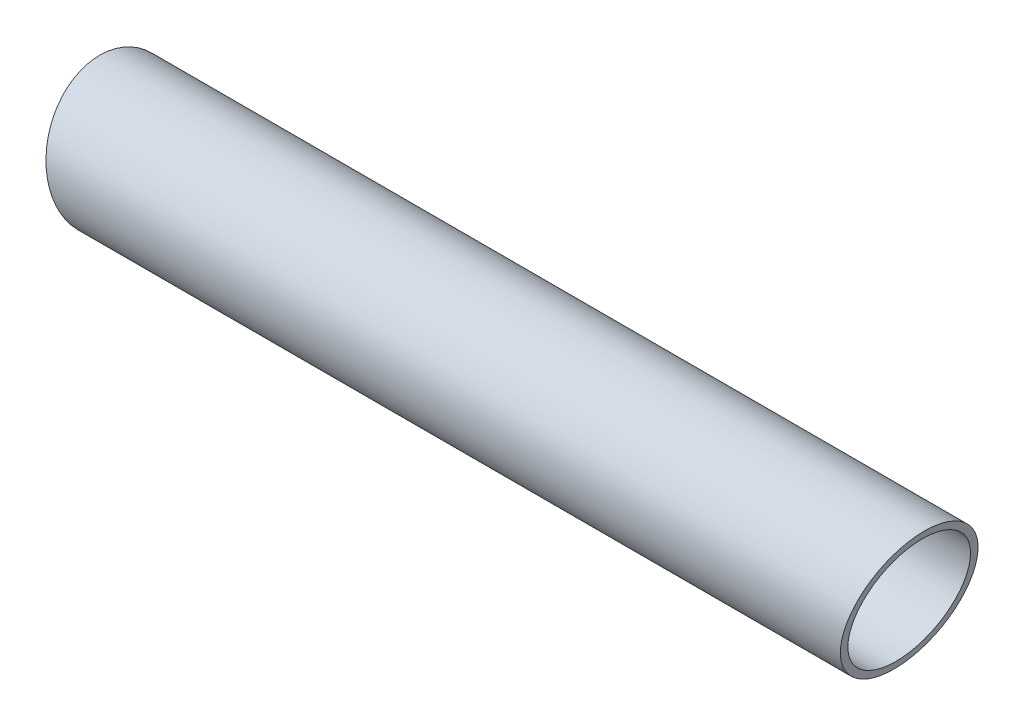
ISO-10303-21;
HEADER;
FILE_DESCRIPTION(('STEP AP214'),'2;1');
FILE_NAME('part.step','',(''),(''),'','','');
FILE_SCHEMA(('AUTOMOTIVE_DESIGN { 1 0 10303 214 1 1 1 1 }'));
ENDSEC;
DATA;
#1=APPLICATION_CONTEXT('core data for automotive mechanical design processes');
#2=APPLICATION_PROTOCOL_DEFINITION('international standard','automotive_design',2000,#1);
#3=PRODUCT_CONTEXT('',#1,'mechanical');
#4=PRODUCT('Part','Part','',(#3));
#5=PRODUCT_RELATED_PRODUCT_CATEGORY('part','',(#4));
#6=PRODUCT_DEFINITION_FORMATION('','',#4);
#7=PRODUCT_DEFINITION_CONTEXT('part definition',#1,'design');
#8=PRODUCT_DEFINITION('design','',#6,#7);
#9=PRODUCT_DEFINITION_SHAPE('','',#8);
#10=(LENGTH_UNIT() NAMED_UNIT(*) SI_UNIT(.MILLI.,.METRE.));
#11=(NAMED_UNIT(*) PLANE_ANGLE_UNIT() SI_UNIT($,.RADIAN.));
#12=(NAMED_UNIT(*) SI_UNIT($,.STERADIAN.) SOLID_ANGLE_UNIT());
#13=UNCERTAINTY_MEASURE_WITH_UNIT(LENGTH_MEASURE(1.E-05),#10,'distance_accuracy_value','');
#14=(GEOMETRIC_REPRESENTATION_CONTEXT(3) GLOBAL_UNCERTAINTY_ASSIGNED_CONTEXT((#13)) GLOBAL_UNIT_ASSIGNED_CONTEXT((#10,
#11,#12)) REPRESENTATION_CONTEXT('',''));
#15=CARTESIAN_POINT('',(0.,0.,0.));
#16=DIRECTION('',(0.,0.,1.));
#17=DIRECTION('',(1.,0.,0.));
#18=AXIS2_PLACEMENT_3D('',#15,#16,#17);
#19=CARTESIAN_POINT('',(-65.0000000000003,539.999999999999,-1140.));
#20=DIRECTION('',(1.,0.,0.));
#21=DIRECTION('',(0.,0.,-1.));
#22=AXIS2_PLACEMENT_3D('',#19,#20,#21);
#23=CYLINDRICAL_SURFACE('',#22,9.79999999999998);
#24=CARTESIAN_POINT('',(-64.9999999999999,539.999999999999,-1140.));
#25=DIRECTION('',(-0.975914622854119,-0.218152810890676,0.));
#26=DIRECTION('',(0.218152810890676,-0.975914622854119,0.));
#27=AXIS2_PLACEMENT_3D('',#24,#25,#26);
#28=ELLIPSE('',#27,10.0418620343441,9.79999999999998);
#29=CARTESIAN_POINT('',(-62.8093395706314,530.199999999999,-1140.));
#30=VERTEX_POINT('',#29);
#31=EDGE_CURVE('E53',#30,#30,#28,.T.);
#32=ORIENTED_EDGE('',*,*,#31,.T.);
#33=EDGE_LOOP('',(#32));
#34=FACE_BOUND('',#33,.T.);
#35=CARTESIAN_POINT('',(64.9999999999999,539.999999999999,-1140.));
#36=DIRECTION('',(0.975914622854119,-0.218152810890675,0.));
#37=DIRECTION('',(0.218152810890675,0.975914622854119,0.));
#38=AXIS2_PLACEMENT_3D('',#35,#36,#37);
#39=ELLIPSE('',#38,10.0418620343441,9.79999999999998);
#40=CARTESIAN_POINT('',(67.1906604293684,549.799999999999,-1140.));
#41=VERTEX_POINT('',#40);
#42=EDGE_CURVE('E43',#41,#41,#39,.T.);
#43=ORIENTED_EDGE('',*,*,#42,.T.);
#44=EDGE_LOOP('',(#43));
#45=FACE_BOUND('',#44,.T.);
#46=ADVANCED_FACE('F39',(#34,#45),#23,.F.);
#47=CARTESIAN_POINT('',(-65.0000000000003,539.999999999999,-1140.));
#48=DIRECTION('',(1.,0.,0.));
#49=DIRECTION('',(0.,0.,-1.));
#50=AXIS2_PLACEMENT_3D('',#47,#48,#49);
#51=CYLINDRICAL_SURFACE('',#50,11.);
#52=CARTESIAN_POINT('',(-64.9999999999999,539.999999999999,-1140.));
#53=DIRECTION('',(-0.975914622854119,-0.218152810890676,0.));
#54=DIRECTION('',(0.218152810890676,-0.975914622854119,0.));
#55=AXIS2_PLACEMENT_3D('',#52,#53,#54);
#56=ELLIPSE('',#55,11.2714777936515,11.);
#57=CARTESIAN_POINT('',(-62.541095436423,528.999999999999,-1140.));
#58=VERTEX_POINT('',#57);
#59=EDGE_CURVE('E47',#58,#58,#56,.T.);
#60=ORIENTED_EDGE('',*,*,#59,.F.);
#61=EDGE_LOOP('',(#60));
#62=FACE_BOUND('',#61,.T.);
#63=CARTESIAN_POINT('',(64.9999999999999,539.999999999999,-1140.));
#64=DIRECTION('',(0.975914622854119,-0.218152810890675,0.));
#65=DIRECTION('',(0.218152810890675,0.975914622854119,0.));
#66=AXIS2_PLACEMENT_3D('',#63,#64,#65);
#67=ELLIPSE('',#66,11.2714777936515,11.);
#68=CARTESIAN_POINT('',(67.4589045635768,550.999999999999,-1140.));
#69=VERTEX_POINT('',#68);
#70=EDGE_CURVE('E10',#69,#69,#67,.T.);
#71=ORIENTED_EDGE('',*,*,#70,.F.);
#72=EDGE_LOOP('',(#71));
#73=FACE_BOUND('',#72,.T.);
#74=ADVANCED_FACE('F67',(#62,#73),#51,.T.);
#75=CARTESIAN_POINT('',(-65.,540.,-1140.));
#76=DIRECTION('',(-0.975914622854119,-0.218152810890676,0.));
#77=DIRECTION('',(0.218152810890676,-0.975914622854119,0.));
#78=AXIS2_PLACEMENT_3D('',#75,#76,#77);
#79=PLANE('',#78);
#80=ORIENTED_EDGE('',*,*,#31,.F.);
#81=EDGE_LOOP('',(#80));
#82=FACE_BOUND('',#81,.T.);
#83=ORIENTED_EDGE('',*,*,#59,.T.);
#84=EDGE_LOOP('',(#83));
#85=FACE_BOUND('',#84,.T.);
#86=ADVANCED_FACE('F62',(#82,#85),#79,.T.);
#87=CARTESIAN_POINT('',(65.,540.,-1140.));
#88=DIRECTION('',(0.975914622854119,-0.218152810890675,0.));
#89=DIRECTION('',(0.218152810890675,0.975914622854119,0.));
#90=AXIS2_PLACEMENT_3D('',#87,#88,#89);
#91=PLANE('',#90);
#92=ORIENTED_EDGE('',*,*,#42,.F.);
#93=EDGE_LOOP('',(#92));
#94=FACE_BOUND('',#93,.T.);
#95=ORIENTED_EDGE('',*,*,#70,.T.);
#96=EDGE_LOOP('',(#95));
#97=FACE_BOUND('',#96,.T.);
#98=ADVANCED_FACE('F41',(#94,#97),#91,.T.);
#99=CLOSED_SHELL('',(#46,#74,#86,#98));
#100=MANIFOLD_SOLID_BREP('B2',#99);
#101=ADVANCED_BREP_SHAPE_REPRESENTATION('',(#18,#100),#14);
#102=SHAPE_DEFINITION_REPRESENTATION(#9,#101);
ENDSEC;
END-ISO-10303-21;
